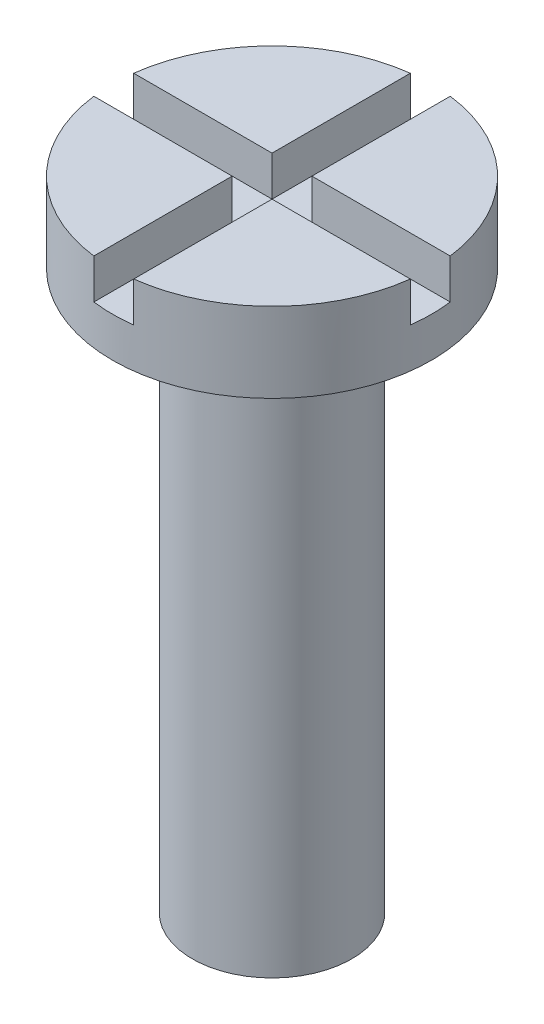
ISO-10303-21;
HEADER;
FILE_DESCRIPTION(('STEP AP214'),'2;1');
FILE_NAME('part.step','',(''),(''),'','','');
FILE_SCHEMA(('AUTOMOTIVE_DESIGN { 1 0 10303 214 1 1 1 1 }'));
ENDSEC;
DATA;
#1=APPLICATION_CONTEXT('core data for automotive mechanical design processes');
#2=APPLICATION_PROTOCOL_DEFINITION('international standard','automotive_design',2000,#1);
#3=PRODUCT_CONTEXT('',#1,'mechanical');
#4=PRODUCT('Part','Part','',(#3));
#5=PRODUCT_RELATED_PRODUCT_CATEGORY('part','',(#4));
#6=PRODUCT_DEFINITION_FORMATION('','',#4);
#7=PRODUCT_DEFINITION_CONTEXT('part definition',#1,'design');
#8=PRODUCT_DEFINITION('design','',#6,#7);
#9=PRODUCT_DEFINITION_SHAPE('','',#8);
#10=(LENGTH_UNIT() NAMED_UNIT(*) SI_UNIT(.MILLI.,.METRE.));
#11=(NAMED_UNIT(*) PLANE_ANGLE_UNIT() SI_UNIT($,.RADIAN.));
#12=(NAMED_UNIT(*) SI_UNIT($,.STERADIAN.) SOLID_ANGLE_UNIT());
#13=UNCERTAINTY_MEASURE_WITH_UNIT(LENGTH_MEASURE(1.E-05),#10,'distance_accuracy_value','');
#14=(GEOMETRIC_REPRESENTATION_CONTEXT(3) GLOBAL_UNCERTAINTY_ASSIGNED_CONTEXT((#13)) GLOBAL_UNIT_ASSIGNED_CONTEXT((#10,
#11,#12)) REPRESENTATION_CONTEXT('',''));
#15=CARTESIAN_POINT('',(0.,0.,0.));
#16=DIRECTION('',(0.,0.,1.));
#17=DIRECTION('',(1.,0.,0.));
#18=AXIS2_PLACEMENT_3D('',#15,#16,#17);
#19=CARTESIAN_POINT('',(0.,8.,0.));
#20=DIRECTION('',(0.,1.,0.));
#21=DIRECTION('',(0.,0.,1.));
#22=AXIS2_PLACEMENT_3D('',#19,#20,#21);
#23=PLANE('',#22);
#24=DIRECTION('',(-1.,0.,0.));
#25=VECTOR('',#24,1.);
#26=CARTESIAN_POINT('',(-2.,8.,-0.25));
#27=LINE('',#26,#25);
#28=CARTESIAN_POINT('',(-0.25,8.,-0.25));
#29=VERTEX_POINT('',#28);
#30=CARTESIAN_POINT('',(-1.98431348329844,8.,-0.25));
#31=VERTEX_POINT('',#30);
#32=EDGE_CURVE('E130',#29,#31,#27,.T.);
#33=ORIENTED_EDGE('',*,*,#32,.F.);
#34=DIRECTION('',(0.,0.,1.));
#35=VECTOR('',#34,1.);
#36=CARTESIAN_POINT('',(-0.25,8.,0.));
#37=LINE('',#36,#35);
#38=CARTESIAN_POINT('',(-0.25,8.,-1.98431348329844));
#39=VERTEX_POINT('',#38);
#40=EDGE_CURVE('E211',#39,#29,#37,.T.);
#41=ORIENTED_EDGE('',*,*,#40,.F.);
#42=CARTESIAN_POINT('',(0.,8.,0.));
#43=DIRECTION('',(0.,1.,0.));
#44=DIRECTION('',(0.,0.,1.));
#45=AXIS2_PLACEMENT_3D('',#42,#43,#44);
#46=CIRCLE('',#45,2.);
#47=EDGE_CURVE('E197',#39,#31,#46,.T.);
#48=ORIENTED_EDGE('',*,*,#47,.T.);
#49=EDGE_LOOP('',(#33,#41,#48));
#50=FACE_BOUND('',#49,.T.);
#51=ADVANCED_FACE('F34',(#50),#23,.T.);
#52=DIRECTION('',(0.,0.,-1.));
#53=VECTOR('',#52,1.);
#54=CARTESIAN_POINT('',(0.25,8.,-2.));
#55=LINE('',#54,#53);
#56=CARTESIAN_POINT('',(0.25,8.,-0.25));
#57=VERTEX_POINT('',#56);
#58=CARTESIAN_POINT('',(0.25,8.,-1.98431348329844));
#59=VERTEX_POINT('',#58);
#60=EDGE_CURVE('E161',#57,#59,#55,.T.);
#61=ORIENTED_EDGE('',*,*,#60,.F.);
#62=DIRECTION('',(-1.,0.,0.));
#63=VECTOR('',#62,1.);
#64=CARTESIAN_POINT('',(0.,8.,-0.25));
#65=LINE('',#64,#63);
#66=CARTESIAN_POINT('',(1.98431348329844,8.,-0.25));
#67=VERTEX_POINT('',#66);
#68=EDGE_CURVE('E210',#67,#57,#65,.T.);
#69=ORIENTED_EDGE('',*,*,#68,.F.);
#70=EDGE_CURVE('E234',#67,#59,#46,.T.);
#71=ORIENTED_EDGE('',*,*,#70,.T.);
#72=EDGE_LOOP('',(#61,#69,#71));
#73=FACE_BOUND('',#72,.T.);
#74=ADVANCED_FACE('F241',(#73),#23,.T.);
#75=DIRECTION('',(1.,0.,0.));
#76=VECTOR('',#75,1.);
#77=CARTESIAN_POINT('',(0.25,8.,0.25));
#78=LINE('',#77,#76);
#79=CARTESIAN_POINT('',(0.25,8.,0.25));
#80=VERTEX_POINT('',#79);
#81=CARTESIAN_POINT('',(1.98431348329844,8.,0.25));
#82=VERTEX_POINT('',#81);
#83=EDGE_CURVE('E159',#80,#82,#78,.T.);
#84=ORIENTED_EDGE('',*,*,#83,.F.);
#85=DIRECTION('',(0.,0.,-1.));
#86=VECTOR('',#85,1.);
#87=CARTESIAN_POINT('',(0.25,8.,0.));
#88=LINE('',#87,#86);
#89=CARTESIAN_POINT('',(0.25,8.,1.98431348329844));
#90=VERTEX_POINT('',#89);
#91=EDGE_CURVE('E208',#90,#80,#88,.T.);
#92=ORIENTED_EDGE('',*,*,#91,.F.);
#93=EDGE_CURVE('E198',#90,#82,#46,.T.);
#94=ORIENTED_EDGE('',*,*,#93,.T.);
#95=EDGE_LOOP('',(#84,#92,#94));
#96=FACE_BOUND('',#95,.T.);
#97=ADVANCED_FACE('F253',(#96),#23,.T.);
#98=CARTESIAN_POINT('',(0.,7.,0.));
#99=DIRECTION('',(0.,-1.,0.));
#100=DIRECTION('',(0.,0.,-1.));
#101=AXIS2_PLACEMENT_3D('',#98,#99,#100);
#102=CYLINDRICAL_SURFACE('',#101,1.);
#103=CARTESIAN_POINT('',(0.,7.,0.));
#104=DIRECTION('',(0.,1.,0.));
#105=DIRECTION('',(0.,0.,1.));
#106=AXIS2_PLACEMENT_3D('',#103,#104,#105);
#107=CIRCLE('',#106,1.);
#108=CARTESIAN_POINT('',(0.,7.,-1.));
#109=VERTEX_POINT('',#108);
#110=EDGE_CURVE('E201',#109,#109,#107,.T.);
#111=CARTESIAN_POINT('',(0.,0.,0.));
#112=DIRECTION('',(0.,1.,0.));
#113=DIRECTION('',(0.,0.,1.));
#114=AXIS2_PLACEMENT_3D('',#111,#112,#113);
#115=CIRCLE('',#114,1.);
#116=CARTESIAN_POINT('',(0.,0.,-1.));
#117=VERTEX_POINT('',#116);
#118=EDGE_CURVE('E204',#117,#117,#115,.T.);
#119=CARTESIAN_POINT('',(0.,7.,-1.));
#120=CARTESIAN_POINT('',(0.,6.92708333333333,-1.));
#121=CARTESIAN_POINT('',(0.,6.85416666666667,-1.));
#122=CARTESIAN_POINT('',(0.,6.70833333333333,-1.));
#123=CARTESIAN_POINT('',(0.,6.63541666666667,-1.));
#124=CARTESIAN_POINT('',(0.,6.48958333333333,-1.));
#125=CARTESIAN_POINT('',(0.,6.41666666666667,-1.));
#126=CARTESIAN_POINT('',(0.,6.27083333333333,-1.));
#127=CARTESIAN_POINT('',(0.,6.19791666666667,-1.));
#128=CARTESIAN_POINT('',(0.,6.05208333333333,-1.));
#129=CARTESIAN_POINT('',(0.,5.97916666666667,-1.));
#130=CARTESIAN_POINT('',(0.,5.83333333333333,-1.));
#131=CARTESIAN_POINT('',(0.,5.76041666666667,-1.));
#132=CARTESIAN_POINT('',(0.,5.61458333333333,-1.));
#133=CARTESIAN_POINT('',(0.,5.54166666666667,-1.));
#134=CARTESIAN_POINT('',(0.,5.39583333333333,-1.));
#135=CARTESIAN_POINT('',(0.,5.32291666666667,-1.));
#136=CARTESIAN_POINT('',(0.,5.17708333333333,-1.));
#137=CARTESIAN_POINT('',(0.,5.10416666666667,-1.));
#138=CARTESIAN_POINT('',(0.,4.95833333333333,-1.));
#139=CARTESIAN_POINT('',(0.,4.88541666666667,-1.));
#140=CARTESIAN_POINT('',(0.,4.73958333333333,-1.));
#141=CARTESIAN_POINT('',(0.,4.66666666666667,-1.));
#142=CARTESIAN_POINT('',(0.,4.52083333333333,-1.));
#143=CARTESIAN_POINT('',(0.,4.44791666666667,-1.));
#144=CARTESIAN_POINT('',(0.,4.30208333333333,-1.));
#145=CARTESIAN_POINT('',(0.,4.22916666666667,-1.));
#146=CARTESIAN_POINT('',(0.,4.08333333333333,-1.));
#147=CARTESIAN_POINT('',(0.,4.01041666666666,-1.));
#148=CARTESIAN_POINT('',(0.,3.86458333333333,-1.));
#149=CARTESIAN_POINT('',(0.,3.79166666666667,-1.));
#150=CARTESIAN_POINT('',(0.,3.64583333333333,-1.));
#151=CARTESIAN_POINT('',(0.,3.57291666666667,-1.));
#152=CARTESIAN_POINT('',(0.,3.42708333333333,-1.));
#153=CARTESIAN_POINT('',(0.,3.35416666666667,-1.));
#154=CARTESIAN_POINT('',(0.,3.20833333333333,-1.));
#155=CARTESIAN_POINT('',(0.,3.13541666666667,-1.));
#156=CARTESIAN_POINT('',(0.,2.98958333333333,-1.));
#157=CARTESIAN_POINT('',(0.,2.91666666666667,-1.));
#158=CARTESIAN_POINT('',(0.,2.77083333333333,-1.));
#159=CARTESIAN_POINT('',(0.,2.69791666666667,-1.));
#160=CARTESIAN_POINT('',(0.,2.55208333333333,-1.));
#161=CARTESIAN_POINT('',(0.,2.47916666666667,-1.));
#162=CARTESIAN_POINT('',(0.,2.33333333333333,-1.));
#163=CARTESIAN_POINT('',(0.,2.26041666666667,-1.));
#164=CARTESIAN_POINT('',(0.,2.11458333333333,-1.));
#165=CARTESIAN_POINT('',(0.,2.04166666666667,-1.));
#166=CARTESIAN_POINT('',(0.,1.89583333333333,-1.));
#167=CARTESIAN_POINT('',(0.,1.82291666666667,-1.));
#168=CARTESIAN_POINT('',(0.,1.67708333333333,-1.));
#169=CARTESIAN_POINT('',(0.,1.60416666666667,-1.));
#170=CARTESIAN_POINT('',(0.,1.45833333333333,-1.));
#171=CARTESIAN_POINT('',(0.,1.38541666666667,-1.));
#172=CARTESIAN_POINT('',(0.,1.23958333333333,-1.));
#173=CARTESIAN_POINT('',(0.,1.16666666666667,-1.));
#174=CARTESIAN_POINT('',(0.,1.02083333333333,-1.));
#175=CARTESIAN_POINT('',(0.,0.947916666666666,-1.));
#176=CARTESIAN_POINT('',(0.,0.802083333333332,-1.));
#177=CARTESIAN_POINT('',(0.,0.729166666666666,-1.));
#178=CARTESIAN_POINT('',(0.,0.583333333333332,-1.));
#179=CARTESIAN_POINT('',(0.,0.510416666666666,-1.));
#180=CARTESIAN_POINT('',(0.,0.364583333333333,-1.));
#181=CARTESIAN_POINT('',(0.,0.291666666666666,-1.));
#182=CARTESIAN_POINT('',(0.,0.145833333333333,-1.));
#183=CARTESIAN_POINT('',(0.,0.0729166666666657,-1.));
#184=CARTESIAN_POINT('',(0.,0.,-1.));
#185=B_SPLINE_CURVE_WITH_KNOTS('',3,(#119,#120,#121,#122,#123,#124,#125,#126,#127,#128,#129,
#130,#131,#132,#133,#134,#135,#136,#137,#138,#139,#140,#141,#142,#143,#144,#145,#146,#147,#148,
#149,#150,#151,#152,#153,#154,#155,#156,#157,#158,#159,#160,#161,#162,#163,#164,#165,#166,#167,
#168,#169,#170,#171,#172,#173,#174,#175,#176,#177,#178,#179,#180,#181,#182,#183,#184),
.UNSPECIFIED.,.F.,.F.,(4,2,2,2,2,2,2,2,2,2,2,2,2,2,2,2,2,2,2,2,2,2,2,2,2,2,2,2,2,2,2,2,4),(0.,
0.21875,0.4375,0.656250000000001,0.875000000000001,1.09375,1.3125,1.53125,1.75,1.96875,2.1875,
2.40625,2.625,2.84375,3.0625,3.28125,3.5,3.71875,3.9375,4.15625,4.375,4.59375,4.8125,5.03125,
5.25,5.46875,5.6875,5.90625,6.125,6.34375,6.5625,6.78125,7.),.UNSPECIFIED.);
#186=EDGE_CURVE('BSEAM36',#109,#117,#185,.T.);
#187=ORIENTED_EDGE('',*,*,#110,.F.);
#188=ORIENTED_EDGE('',*,*,#118,.T.);
#189=ORIENTED_EDGE('',*,*,#186,.T.);
#190=ORIENTED_EDGE('',*,*,#186,.F.);
#191=EDGE_LOOP('',(#187,#189,#188,#190));
#192=FACE_BOUND('',#191,.T.);
#193=ADVANCED_FACE('F36',(#192),#102,.T.);
#194=CARTESIAN_POINT('',(0.,0.,0.));
#195=DIRECTION('',(0.,1.,0.));
#196=DIRECTION('',(0.,0.,1.));
#197=AXIS2_PLACEMENT_3D('',#194,#195,#196);
#198=PLANE('',#197);
#199=ORIENTED_EDGE('',*,*,#118,.F.);
#200=EDGE_LOOP('',(#199));
#201=FACE_BOUND('',#200,.T.);
#202=ADVANCED_FACE('F261',(#201),#198,.F.);
#203=CARTESIAN_POINT('',(0.,7.,0.));
#204=DIRECTION('',(0.,1.,0.));
#205=DIRECTION('',(0.,0.,1.));
#206=AXIS2_PLACEMENT_3D('',#203,#204,#205);
#207=PLANE('',#206);
#208=CARTESIAN_POINT('',(0.,7.,0.));
#209=DIRECTION('',(0.,1.,0.));
#210=DIRECTION('',(0.,0.,1.));
#211=AXIS2_PLACEMENT_3D('',#208,#209,#210);
#212=CIRCLE('',#211,2.);
#213=CARTESIAN_POINT('',(0.,7.,2.));
#214=VERTEX_POINT('',#213);
#215=EDGE_CURVE('E193',#214,#214,#212,.T.);
#216=ORIENTED_EDGE('',*,*,#215,.F.);
#217=EDGE_LOOP('',(#216));
#218=FACE_BOUND('',#217,.T.);
#219=ORIENTED_EDGE('',*,*,#110,.T.);
#220=EDGE_LOOP('',(#219));
#221=FACE_BOUND('',#220,.T.);
#222=ADVANCED_FACE('F345',(#218,#221),#207,.F.);
#223=CARTESIAN_POINT('',(0.,8.,0.));
#224=DIRECTION('',(0.,-1.,0.));
#225=DIRECTION('',(0.,0.,-1.));
#226=AXIS2_PLACEMENT_3D('',#223,#224,#225);
#227=CYLINDRICAL_SURFACE('',#226,2.);
#228=ORIENTED_EDGE('',*,*,#70,.F.);
#229=DIRECTION('',(0.,-1.,0.));
#230=VECTOR('',#229,1.);
#231=CARTESIAN_POINT('',(1.98431348329844,8.,-0.25));
#232=LINE('',#231,#230);
#233=CARTESIAN_POINT('',(1.98431348329844,7.5,-0.25));
#234=VERTEX_POINT('',#233);
#235=EDGE_CURVE('E179',#67,#234,#232,.T.);
#236=ORIENTED_EDGE('',*,*,#235,.T.);
#237=CARTESIAN_POINT('',(0.,7.5,0.));
#238=DIRECTION('',(0.,-1.,0.));
#239=DIRECTION('',(0.,0.,-1.));
#240=AXIS2_PLACEMENT_3D('',#237,#238,#239);
#241=CIRCLE('',#240,2.);
#242=CARTESIAN_POINT('',(1.98431348329844,7.5,0.25));
#243=VERTEX_POINT('',#242);
#244=EDGE_CURVE('E11',#234,#243,#241,.T.);
#245=ORIENTED_EDGE('',*,*,#244,.T.);
#246=DIRECTION('',(0.,-1.,0.));
#247=VECTOR('',#246,1.);
#248=CARTESIAN_POINT('',(1.98431348329844,8.,0.25));
#249=LINE('',#248,#247);
#250=EDGE_CURVE('E176',#243,#82,#249,.F.);
#251=ORIENTED_EDGE('',*,*,#250,.T.);
#252=ORIENTED_EDGE('',*,*,#93,.F.);
#253=DIRECTION('',(0.,-1.,0.));
#254=VECTOR('',#253,1.);
#255=CARTESIAN_POINT('',(0.25,8.,1.98431348329844));
#256=LINE('',#255,#254);
#257=CARTESIAN_POINT('',(0.25,7.5,1.98431348329844));
#258=VERTEX_POINT('',#257);
#259=EDGE_CURVE('E173',#90,#258,#256,.T.);
#260=ORIENTED_EDGE('',*,*,#259,.T.);
#261=CARTESIAN_POINT('',(-0.25,7.5,1.98431348329844));
#262=VERTEX_POINT('',#261);
#263=EDGE_CURVE('E43',#258,#262,#241,.T.);
#264=ORIENTED_EDGE('',*,*,#263,.T.);
#265=DIRECTION('',(0.,-1.,0.));
#266=VECTOR('',#265,1.);
#267=CARTESIAN_POINT('',(-0.25,8.,1.98431348329844));
#268=LINE('',#267,#266);
#269=CARTESIAN_POINT('',(-0.25,8.,1.98431348329844));
#270=VERTEX_POINT('',#269);
#271=EDGE_CURVE('E141',#262,#270,#268,.F.);
#272=ORIENTED_EDGE('',*,*,#271,.T.);
#273=CARTESIAN_POINT('',(-1.98431348329844,8.,0.25));
#274=VERTEX_POINT('',#273);
#275=EDGE_CURVE('E194',#274,#270,#46,.T.);
#276=ORIENTED_EDGE('',*,*,#275,.F.);
#277=DIRECTION('',(0.,-1.,0.));
#278=VECTOR('',#277,1.);
#279=CARTESIAN_POINT('',(-1.98431348329844,8.,0.25));
#280=LINE('',#279,#278);
#281=CARTESIAN_POINT('',(-1.98431348329844,7.5,0.25));
#282=VERTEX_POINT('',#281);
#283=EDGE_CURVE('E191',#274,#282,#280,.T.);
#284=ORIENTED_EDGE('',*,*,#283,.T.);
#285=CARTESIAN_POINT('',(-1.98431348329844,7.5,-0.25));
#286=VERTEX_POINT('',#285);
#287=EDGE_CURVE('E58',#282,#286,#241,.T.);
#288=ORIENTED_EDGE('',*,*,#287,.T.);
#289=DIRECTION('',(0.,-1.,0.));
#290=VECTOR('',#289,1.);
#291=CARTESIAN_POINT('',(-1.98431348329844,8.,-0.25));
#292=LINE('',#291,#290);
#293=EDGE_CURVE('E188',#286,#31,#292,.F.);
#294=ORIENTED_EDGE('',*,*,#293,.T.);
#295=ORIENTED_EDGE('',*,*,#47,.F.);
#296=DIRECTION('',(0.,-1.,0.));
#297=VECTOR('',#296,1.);
#298=CARTESIAN_POINT('',(-0.25,8.,-1.98431348329844));
#299=LINE('',#298,#297);
#300=CARTESIAN_POINT('',(-0.25,7.5,-1.98431348329844));
#301=VERTEX_POINT('',#300);
#302=EDGE_CURVE('E185',#39,#301,#299,.T.);
#303=ORIENTED_EDGE('',*,*,#302,.T.);
#304=CARTESIAN_POINT('',(0.25,7.5,-1.98431348329844));
#305=VERTEX_POINT('',#304);
#306=EDGE_CURVE('E38',#301,#305,#241,.T.);
#307=ORIENTED_EDGE('',*,*,#306,.T.);
#308=DIRECTION('',(0.,-1.,0.));
#309=VECTOR('',#308,1.);
#310=CARTESIAN_POINT('',(0.25,8.,-1.98431348329844));
#311=LINE('',#310,#309);
#312=EDGE_CURVE('E182',#305,#59,#311,.F.);
#313=ORIENTED_EDGE('',*,*,#312,.T.);
#314=EDGE_LOOP('',(#228,#236,#245,#251,#252,#260,#264,#272,#276,#284,#288,#294,#295,#303,#307,#313));
#315=FACE_BOUND('',#314,.T.);
#316=ORIENTED_EDGE('',*,*,#215,.T.);
#317=EDGE_LOOP('',(#316));
#318=FACE_BOUND('',#317,.T.);
#319=ADVANCED_FACE('F218',(#315,#318),#227,.T.);
#320=DIRECTION('',(1.,0.,0.));
#321=VECTOR('',#320,1.);
#322=CARTESIAN_POINT('',(0.,8.,0.25));
#323=LINE('',#322,#321);
#324=CARTESIAN_POINT('',(-0.25,8.,0.25));
#325=VERTEX_POINT('',#324);
#326=EDGE_CURVE('E134',#274,#325,#323,.T.);
#327=ORIENTED_EDGE('',*,*,#326,.F.);
#328=ORIENTED_EDGE('',*,*,#275,.T.);
#329=DIRECTION('',(0.,0.,1.));
#330=VECTOR('',#329,1.);
#331=CARTESIAN_POINT('',(-0.25,8.,0.25));
#332=LINE('',#331,#330);
#333=EDGE_CURVE('E157',#325,#270,#332,.T.);
#334=ORIENTED_EDGE('',*,*,#333,.F.);
#335=EDGE_LOOP('',(#327,#328,#334));
#336=FACE_BOUND('',#335,.T.);
#337=ADVANCED_FACE('F256',(#336),#23,.T.);
#338=CARTESIAN_POINT('',(-0.25,7.5,0.25));
#339=DIRECTION('',(0.,-1.,0.));
#340=DIRECTION('',(0.,0.,-1.));
#341=AXIS2_PLACEMENT_3D('',#338,#339,#340);
#342=PLANE('',#341);
#343=DIRECTION('',(-1.,0.,0.));
#344=VECTOR('',#343,1.);
#345=CARTESIAN_POINT('',(0.25,7.5,-0.25));
#346=LINE('',#345,#344);
#347=CARTESIAN_POINT('',(0.25,7.5,-0.25));
#348=VERTEX_POINT('',#347);
#349=EDGE_CURVE('E149',#234,#348,#346,.T.);
#350=ORIENTED_EDGE('',*,*,#349,.T.);
#351=DIRECTION('',(0.,0.,-1.));
#352=VECTOR('',#351,1.);
#353=CARTESIAN_POINT('',(0.25,7.5,-2.));
#354=LINE('',#353,#352);
#355=EDGE_CURVE('E151',#348,#305,#354,.T.);
#356=ORIENTED_EDGE('',*,*,#355,.T.);
#357=ORIENTED_EDGE('',*,*,#306,.F.);
#358=DIRECTION('',(0.,0.,1.));
#359=VECTOR('',#358,1.);
#360=CARTESIAN_POINT('',(-0.25,7.5,-2.));
#361=LINE('',#360,#359);
#362=CARTESIAN_POINT('',(-0.25,7.5,-0.25));
#363=VERTEX_POINT('',#362);
#364=EDGE_CURVE('E154',#301,#363,#361,.T.);
#365=ORIENTED_EDGE('',*,*,#364,.T.);
#366=DIRECTION('',(-1.,0.,0.));
#367=VECTOR('',#366,1.);
#368=CARTESIAN_POINT('',(-2.,7.5,-0.25));
#369=LINE('',#368,#367);
#370=EDGE_CURVE('E137',#363,#286,#369,.T.);
#371=ORIENTED_EDGE('',*,*,#370,.T.);
#372=ORIENTED_EDGE('',*,*,#287,.F.);
#373=DIRECTION('',(1.,0.,0.));
#374=VECTOR('',#373,1.);
#375=CARTESIAN_POINT('',(-2.,7.5,0.25));
#376=LINE('',#375,#374);
#377=CARTESIAN_POINT('',(-0.25,7.5,0.25));
#378=VERTEX_POINT('',#377);
#379=EDGE_CURVE('E124',#282,#378,#376,.T.);
#380=ORIENTED_EDGE('',*,*,#379,.T.);
#381=DIRECTION('',(0.,0.,1.));
#382=VECTOR('',#381,1.);
#383=CARTESIAN_POINT('',(-0.25,7.5,0.25));
#384=LINE('',#383,#382);
#385=EDGE_CURVE('E126',#378,#262,#384,.T.);
#386=ORIENTED_EDGE('',*,*,#385,.T.);
#387=ORIENTED_EDGE('',*,*,#263,.F.);
#388=DIRECTION('',(0.,0.,-1.));
#389=VECTOR('',#388,1.);
#390=CARTESIAN_POINT('',(0.25,7.5,0.25));
#391=LINE('',#390,#389);
#392=CARTESIAN_POINT('',(0.25,7.5,0.25));
#393=VERTEX_POINT('',#392);
#394=EDGE_CURVE('E142',#258,#393,#391,.T.);
#395=ORIENTED_EDGE('',*,*,#394,.T.);
#396=DIRECTION('',(1.,0.,0.));
#397=VECTOR('',#396,1.);
#398=CARTESIAN_POINT('',(0.25,7.5,0.25));
#399=LINE('',#398,#397);
#400=EDGE_CURVE('E144',#393,#243,#399,.T.);
#401=ORIENTED_EDGE('',*,*,#400,.T.);
#402=ORIENTED_EDGE('',*,*,#244,.F.);
#403=EDGE_LOOP('',(#350,#356,#357,#365,#371,#372,#380,#386,#387,#395,#401,#402));
#404=FACE_BOUND('',#403,.T.);
#405=ADVANCED_FACE('F125',(#404),#342,.F.);
#406=CARTESIAN_POINT('',(-2.,7.5,0.25));
#407=DIRECTION('',(0.,0.,1.));
#408=DIRECTION('',(1.,0.,0.));
#409=AXIS2_PLACEMENT_3D('',#406,#407,#408);
#410=PLANE('',#409);
#411=ORIENTED_EDGE('',*,*,#326,.T.);
#412=DIRECTION('',(0.,1.,0.));
#413=VECTOR('',#412,1.);
#414=CARTESIAN_POINT('',(-0.25,7.5,0.25));
#415=LINE('',#414,#413);
#416=EDGE_CURVE('E50',#378,#325,#415,.T.);
#417=ORIENTED_EDGE('',*,*,#416,.F.);
#418=ORIENTED_EDGE('',*,*,#379,.F.);
#419=ORIENTED_EDGE('',*,*,#283,.F.);
#420=EDGE_LOOP('',(#411,#417,#418,#419));
#421=FACE_BOUND('',#420,.T.);
#422=ADVANCED_FACE('F132',(#421),#410,.F.);
#423=CARTESIAN_POINT('',(-2.,7.5,-0.25));
#424=DIRECTION('',(0.,0.,-1.));
#425=DIRECTION('',(-1.,0.,0.));
#426=AXIS2_PLACEMENT_3D('',#423,#424,#425);
#427=PLANE('',#426);
#428=ORIENTED_EDGE('',*,*,#370,.F.);
#429=DIRECTION('',(0.,1.,0.));
#430=VECTOR('',#429,1.);
#431=CARTESIAN_POINT('',(-0.25,7.5,-0.25));
#432=LINE('',#431,#430);
#433=EDGE_CURVE('E164',#363,#29,#432,.T.);
#434=ORIENTED_EDGE('',*,*,#433,.T.);
#435=ORIENTED_EDGE('',*,*,#32,.T.);
#436=ORIENTED_EDGE('',*,*,#293,.F.);
#437=EDGE_LOOP('',(#428,#434,#435,#436));
#438=FACE_BOUND('',#437,.T.);
#439=ADVANCED_FACE('F271',(#438),#427,.F.);
#440=CARTESIAN_POINT('',(-0.25,7.5,-2.));
#441=DIRECTION('',(-1.,0.,0.));
#442=DIRECTION('',(0.,0.,1.));
#443=AXIS2_PLACEMENT_3D('',#440,#441,#442);
#444=PLANE('',#443);
#445=ORIENTED_EDGE('',*,*,#40,.T.);
#446=ORIENTED_EDGE('',*,*,#433,.F.);
#447=ORIENTED_EDGE('',*,*,#364,.F.);
#448=ORIENTED_EDGE('',*,*,#302,.F.);
#449=EDGE_LOOP('',(#445,#446,#447,#448));
#450=FACE_BOUND('',#449,.T.);
#451=ADVANCED_FACE('F246',(#450),#444,.F.);
#452=CARTESIAN_POINT('',(0.25,7.5,-2.));
#453=DIRECTION('',(1.,0.,0.));
#454=DIRECTION('',(0.,0.,-1.));
#455=AXIS2_PLACEMENT_3D('',#452,#453,#454);
#456=PLANE('',#455);
#457=ORIENTED_EDGE('',*,*,#355,.F.);
#458=DIRECTION('',(0.,1.,0.));
#459=VECTOR('',#458,1.);
#460=CARTESIAN_POINT('',(0.25,7.5,-0.25));
#461=LINE('',#460,#459);
#462=EDGE_CURVE('E167',#348,#57,#461,.T.);
#463=ORIENTED_EDGE('',*,*,#462,.T.);
#464=ORIENTED_EDGE('',*,*,#60,.T.);
#465=ORIENTED_EDGE('',*,*,#312,.F.);
#466=EDGE_LOOP('',(#457,#463,#464,#465));
#467=FACE_BOUND('',#466,.T.);
#468=ADVANCED_FACE('F244',(#467),#456,.F.);
#469=CARTESIAN_POINT('',(0.25,7.5,-0.25));
#470=DIRECTION('',(0.,0.,-1.));
#471=DIRECTION('',(-1.,0.,0.));
#472=AXIS2_PLACEMENT_3D('',#469,#470,#471);
#473=PLANE('',#472);
#474=ORIENTED_EDGE('',*,*,#68,.T.);
#475=ORIENTED_EDGE('',*,*,#462,.F.);
#476=ORIENTED_EDGE('',*,*,#349,.F.);
#477=ORIENTED_EDGE('',*,*,#235,.F.);
#478=EDGE_LOOP('',(#474,#475,#476,#477));
#479=FACE_BOUND('',#478,.T.);
#480=ADVANCED_FACE('F237',(#479),#473,.F.);
#481=CARTESIAN_POINT('',(0.25,7.5,0.25));
#482=DIRECTION('',(0.,0.,1.));
#483=DIRECTION('',(1.,0.,0.));
#484=AXIS2_PLACEMENT_3D('',#481,#482,#483);
#485=PLANE('',#484);
#486=ORIENTED_EDGE('',*,*,#400,.F.);
#487=DIRECTION('',(0.,1.,0.));
#488=VECTOR('',#487,1.);
#489=CARTESIAN_POINT('',(0.25,7.5,0.25));
#490=LINE('',#489,#488);
#491=EDGE_CURVE('E136',#393,#80,#490,.T.);
#492=ORIENTED_EDGE('',*,*,#491,.T.);
#493=ORIENTED_EDGE('',*,*,#83,.T.);
#494=ORIENTED_EDGE('',*,*,#250,.F.);
#495=EDGE_LOOP('',(#486,#492,#493,#494));
#496=FACE_BOUND('',#495,.T.);
#497=ADVANCED_FACE('F230',(#496),#485,.F.);
#498=CARTESIAN_POINT('',(0.25,7.5,0.25));
#499=DIRECTION('',(1.,0.,0.));
#500=DIRECTION('',(0.,0.,-1.));
#501=AXIS2_PLACEMENT_3D('',#498,#499,#500);
#502=PLANE('',#501);
#503=ORIENTED_EDGE('',*,*,#91,.T.);
#504=ORIENTED_EDGE('',*,*,#491,.F.);
#505=ORIENTED_EDGE('',*,*,#394,.F.);
#506=ORIENTED_EDGE('',*,*,#259,.F.);
#507=EDGE_LOOP('',(#503,#504,#505,#506));
#508=FACE_BOUND('',#507,.T.);
#509=ADVANCED_FACE('F225',(#508),#502,.F.);
#510=CARTESIAN_POINT('',(-0.25,7.5,0.25));
#511=DIRECTION('',(-1.,0.,0.));
#512=DIRECTION('',(0.,0.,1.));
#513=AXIS2_PLACEMENT_3D('',#510,#511,#512);
#514=PLANE('',#513);
#515=ORIENTED_EDGE('',*,*,#385,.F.);
#516=ORIENTED_EDGE('',*,*,#416,.T.);
#517=ORIENTED_EDGE('',*,*,#333,.T.);
#518=ORIENTED_EDGE('',*,*,#271,.F.);
#519=EDGE_LOOP('',(#515,#516,#517,#518));
#520=FACE_BOUND('',#519,.T.);
#521=ADVANCED_FACE('F139',(#520),#514,.F.);
#522=CLOSED_SHELL('',(#51,#74,#97,#193,#202,#222,#319,#337,#405,#422,#439,#451,#468,#480,#497,
#509,#521));
#523=MANIFOLD_SOLID_BREP('B2',#522);
#524=ADVANCED_BREP_SHAPE_REPRESENTATION('',(#18,#523),#14);
#525=SHAPE_DEFINITION_REPRESENTATION(#9,#524);
ENDSEC;
END-ISO-10303-21;
